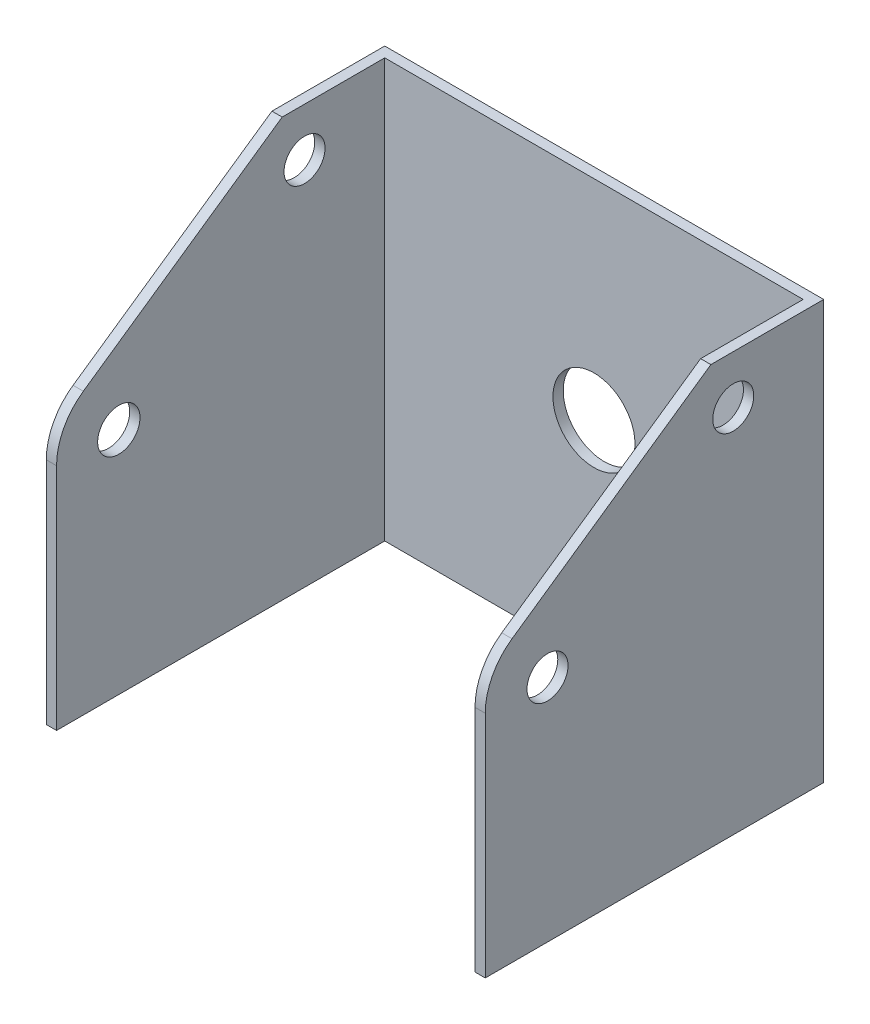
ISO-10303-21;
HEADER;
FILE_DESCRIPTION(('STEP AP214'),'2;1');
FILE_NAME('part.step','',(''),(''),'','','');
FILE_SCHEMA(('AUTOMOTIVE_DESIGN { 1 0 10303 214 1 1 1 1 }'));
ENDSEC;
DATA;
#1=APPLICATION_CONTEXT('core data for automotive mechanical design processes');
#2=APPLICATION_PROTOCOL_DEFINITION('international standard','automotive_design',2000,#1);
#3=PRODUCT_CONTEXT('',#1,'mechanical');
#4=PRODUCT('Part','Part','',(#3));
#5=PRODUCT_RELATED_PRODUCT_CATEGORY('part','',(#4));
#6=PRODUCT_DEFINITION_FORMATION('','',#4);
#7=PRODUCT_DEFINITION_CONTEXT('part definition',#1,'design');
#8=PRODUCT_DEFINITION('design','',#6,#7);
#9=PRODUCT_DEFINITION_SHAPE('','',#8);
#10=(LENGTH_UNIT() NAMED_UNIT(*) SI_UNIT(.MILLI.,.METRE.));
#11=(NAMED_UNIT(*) PLANE_ANGLE_UNIT() SI_UNIT($,.RADIAN.));
#12=(NAMED_UNIT(*) SI_UNIT($,.STERADIAN.) SOLID_ANGLE_UNIT());
#13=UNCERTAINTY_MEASURE_WITH_UNIT(LENGTH_MEASURE(1.E-05),#10,'distance_accuracy_value','');
#14=(GEOMETRIC_REPRESENTATION_CONTEXT(3) GLOBAL_UNCERTAINTY_ASSIGNED_CONTEXT((#13)) GLOBAL_UNIT_ASSIGNED_CONTEXT((#10,
#11,#12)) REPRESENTATION_CONTEXT('',''));
#15=CARTESIAN_POINT('',(0.,0.,0.));
#16=DIRECTION('',(0.,0.,1.));
#17=DIRECTION('',(1.,0.,0.));
#18=AXIS2_PLACEMENT_3D('',#15,#16,#17);
#19=CARTESIAN_POINT('',(0.,0.,5.));
#20=DIRECTION('',(0.,0.,-1.));
#21=DIRECTION('',(-1.,0.,0.));
#22=AXIS2_PLACEMENT_3D('',#19,#20,#21);
#23=PLANE('',#22);
#24=DIRECTION('',(0.,1.,0.));
#25=VECTOR('',#24,1.);
#26=CARTESIAN_POINT('',(102.,-102.,5.));
#27=LINE('',#26,#25);
#28=CARTESIAN_POINT('',(102.,-102.,5.));
#29=VERTEX_POINT('',#28);
#30=CARTESIAN_POINT('',(102.,102.,5.));
#31=VERTEX_POINT('',#30);
#32=EDGE_CURVE('E222',#29,#31,#27,.T.);
#33=ORIENTED_EDGE('',*,*,#32,.T.);
#34=DIRECTION('',(-1.,0.,0.));
#35=VECTOR('',#34,1.);
#36=CARTESIAN_POINT('',(-102.,102.,5.));
#37=LINE('',#36,#35);
#38=CARTESIAN_POINT('',(-102.,102.,5.));
#39=VERTEX_POINT('',#38);
#40=EDGE_CURVE('E225',#31,#39,#37,.T.);
#41=ORIENTED_EDGE('',*,*,#40,.T.);
#42=DIRECTION('',(0.,-1.,0.));
#43=VECTOR('',#42,1.);
#44=CARTESIAN_POINT('',(-102.,-102.,5.));
#45=LINE('',#44,#43);
#46=CARTESIAN_POINT('',(-102.,-102.,5.));
#47=VERTEX_POINT('',#46);
#48=EDGE_CURVE('E36',#39,#47,#45,.T.);
#49=ORIENTED_EDGE('',*,*,#48,.T.);
#50=DIRECTION('',(1.,0.,0.));
#51=VECTOR('',#50,1.);
#52=CARTESIAN_POINT('',(-102.,-102.,5.));
#53=LINE('',#52,#51);
#54=EDGE_CURVE('E11',#47,#29,#53,.T.);
#55=ORIENTED_EDGE('',*,*,#54,.T.);
#56=EDGE_LOOP('',(#33,#41,#49,#55));
#57=FACE_BOUND('',#56,.T.);
#58=CARTESIAN_POINT('',(0.,0.,5.));
#59=DIRECTION('',(0.,0.,1.));
#60=DIRECTION('',(1.,0.,0.));
#61=AXIS2_PLACEMENT_3D('',#58,#59,#60);
#62=CIRCLE('',#61,20.);
#63=CARTESIAN_POINT('',(20.,0.,5.));
#64=VERTEX_POINT('',#63);
#65=EDGE_CURVE('E134',#64,#64,#62,.T.);
#66=ORIENTED_EDGE('',*,*,#65,.F.);
#67=EDGE_LOOP('',(#66));
#68=FACE_BOUND('',#67,.T.);
#69=ADVANCED_FACE('F32',(#57,#68),#23,.F.);
#70=CARTESIAN_POINT('',(0.,0.,0.));
#71=DIRECTION('',(0.,0.,-1.));
#72=DIRECTION('',(-1.,0.,0.));
#73=AXIS2_PLACEMENT_3D('',#70,#71,#72);
#74=PLANE('',#73);
#75=DIRECTION('',(-1.,0.,0.));
#76=VECTOR('',#75,1.);
#77=CARTESIAN_POINT('',(-102.,102.,0.));
#78=LINE('',#77,#76);
#79=CARTESIAN_POINT('',(107.,102.,0.));
#80=VERTEX_POINT('',#79);
#81=CARTESIAN_POINT('',(-107.,102.,0.));
#82=VERTEX_POINT('',#81);
#83=EDGE_CURVE('E123',#80,#82,#78,.T.);
#84=ORIENTED_EDGE('',*,*,#83,.F.);
#85=DIRECTION('',(0.,1.,0.));
#86=VECTOR('',#85,1.);
#87=CARTESIAN_POINT('',(107.,-102.,0.));
#88=LINE('',#87,#86);
#89=CARTESIAN_POINT('',(107.,-102.,0.));
#90=VERTEX_POINT('',#89);
#91=EDGE_CURVE('E190',#90,#80,#88,.T.);
#92=ORIENTED_EDGE('',*,*,#91,.F.);
#93=DIRECTION('',(1.,0.,0.));
#94=VECTOR('',#93,1.);
#95=CARTESIAN_POINT('',(-102.,-102.,0.));
#96=LINE('',#95,#94);
#97=CARTESIAN_POINT('',(-107.,-102.,0.));
#98=VERTEX_POINT('',#97);
#99=EDGE_CURVE('E133',#98,#90,#96,.T.);
#100=ORIENTED_EDGE('',*,*,#99,.F.);
#101=DIRECTION('',(0.,-1.,0.));
#102=VECTOR('',#101,1.);
#103=CARTESIAN_POINT('',(-107.,102.,0.));
#104=LINE('',#103,#102);
#105=EDGE_CURVE('E137',#82,#98,#104,.T.);
#106=ORIENTED_EDGE('',*,*,#105,.F.);
#107=EDGE_LOOP('',(#84,#92,#100,#106));
#108=FACE_BOUND('',#107,.T.);
#109=CARTESIAN_POINT('',(0.,0.,0.));
#110=DIRECTION('',(0.,0.,1.));
#111=DIRECTION('',(1.,0.,0.));
#112=AXIS2_PLACEMENT_3D('',#109,#110,#111);
#113=CIRCLE('',#112,20.);
#114=CARTESIAN_POINT('',(20.,0.,0.));
#115=VERTEX_POINT('',#114);
#116=EDGE_CURVE('E215',#115,#115,#113,.T.);
#117=ORIENTED_EDGE('',*,*,#116,.T.);
#118=EDGE_LOOP('',(#117));
#119=FACE_BOUND('',#118,.T.);
#120=ADVANCED_FACE('F138',(#108,#119),#74,.T.);
#121=CARTESIAN_POINT('',(-102.,102.,5.));
#122=DIRECTION('',(0.,-1.,0.));
#123=DIRECTION('',(0.,0.,-1.));
#124=AXIS2_PLACEMENT_3D('',#121,#122,#123);
#125=PLANE('',#124);
#126=ORIENTED_EDGE('',*,*,#83,.T.);
#127=DIRECTION('',(0.,0.,-1.));
#128=VECTOR('',#127,1.);
#129=CARTESIAN_POINT('',(-107.,102.,0.));
#130=LINE('',#129,#128);
#131=CARTESIAN_POINT('',(-107.,102.,55.));
#132=VERTEX_POINT('',#131);
#133=EDGE_CURVE('E127',#132,#82,#130,.T.);
#134=ORIENTED_EDGE('',*,*,#133,.F.);
#135=DIRECTION('',(1.,0.,0.));
#136=VECTOR('',#135,1.);
#137=CARTESIAN_POINT('',(-107.,102.,55.));
#138=LINE('',#137,#136);
#139=CARTESIAN_POINT('',(-102.,102.,55.));
#140=VERTEX_POINT('',#139);
#141=EDGE_CURVE('E163',#132,#140,#138,.T.);
#142=ORIENTED_EDGE('',*,*,#141,.T.);
#143=DIRECTION('',(0.,0.,-1.));
#144=VECTOR('',#143,1.);
#145=CARTESIAN_POINT('',(-102.,102.,0.));
#146=LINE('',#145,#144);
#147=EDGE_CURVE('E169',#140,#39,#146,.T.);
#148=ORIENTED_EDGE('',*,*,#147,.T.);
#149=ORIENTED_EDGE('',*,*,#40,.F.);
#150=DIRECTION('',(0.,0.,1.));
#151=VECTOR('',#150,1.);
#152=CARTESIAN_POINT('',(102.,102.,0.));
#153=LINE('',#152,#151);
#154=CARTESIAN_POINT('',(102.,102.,55.));
#155=VERTEX_POINT('',#154);
#156=EDGE_CURVE('E57',#31,#155,#153,.T.);
#157=ORIENTED_EDGE('',*,*,#156,.T.);
#158=DIRECTION('',(-1.,0.,0.));
#159=VECTOR('',#158,1.);
#160=CARTESIAN_POINT('',(107.,102.,55.));
#161=LINE('',#160,#159);
#162=CARTESIAN_POINT('',(107.,102.,55.));
#163=VERTEX_POINT('',#162);
#164=EDGE_CURVE('E218',#163,#155,#161,.T.);
#165=ORIENTED_EDGE('',*,*,#164,.F.);
#166=DIRECTION('',(0.,0.,1.));
#167=VECTOR('',#166,1.);
#168=CARTESIAN_POINT('',(107.,102.,0.));
#169=LINE('',#168,#167);
#170=EDGE_CURVE('E129',#80,#163,#169,.T.);
#171=ORIENTED_EDGE('',*,*,#170,.F.);
#172=EDGE_LOOP('',(#126,#134,#142,#148,#149,#157,#165,#171));
#173=FACE_BOUND('',#172,.T.);
#174=ADVANCED_FACE('F34',(#173),#125,.F.);
#175=CARTESIAN_POINT('',(-102.,-102.,5.));
#176=DIRECTION('',(0.,1.,0.));
#177=DIRECTION('',(0.,0.,1.));
#178=AXIS2_PLACEMENT_3D('',#175,#176,#177);
#179=PLANE('',#178);
#180=ORIENTED_EDGE('',*,*,#99,.T.);
#181=DIRECTION('',(0.,0.,-1.));
#182=VECTOR('',#181,1.);
#183=CARTESIAN_POINT('',(107.,-102.,165.));
#184=LINE('',#183,#182);
#185=CARTESIAN_POINT('',(107.,-102.,165.));
#186=VERTEX_POINT('',#185);
#187=EDGE_CURVE('E200',#186,#90,#184,.T.);
#188=ORIENTED_EDGE('',*,*,#187,.F.);
#189=DIRECTION('',(-1.,0.,0.));
#190=VECTOR('',#189,1.);
#191=CARTESIAN_POINT('',(107.,-102.,165.));
#192=LINE('',#191,#190);
#193=CARTESIAN_POINT('',(102.,-102.,165.));
#194=VERTEX_POINT('',#193);
#195=EDGE_CURVE('E203',#186,#194,#192,.T.);
#196=ORIENTED_EDGE('',*,*,#195,.T.);
#197=DIRECTION('',(0.,0.,-1.));
#198=VECTOR('',#197,1.);
#199=CARTESIAN_POINT('',(102.,-102.,0.));
#200=LINE('',#199,#198);
#201=EDGE_CURVE('E192',#194,#29,#200,.T.);
#202=ORIENTED_EDGE('',*,*,#201,.T.);
#203=ORIENTED_EDGE('',*,*,#54,.F.);
#204=DIRECTION('',(0.,0.,1.));
#205=VECTOR('',#204,1.);
#206=CARTESIAN_POINT('',(-102.,-102.,0.));
#207=LINE('',#206,#205);
#208=CARTESIAN_POINT('',(-102.,-102.,165.));
#209=VERTEX_POINT('',#208);
#210=EDGE_CURVE('E49',#47,#209,#207,.T.);
#211=ORIENTED_EDGE('',*,*,#210,.T.);
#212=DIRECTION('',(1.,0.,0.));
#213=VECTOR('',#212,1.);
#214=CARTESIAN_POINT('',(-107.,-102.,165.));
#215=LINE('',#214,#213);
#216=CARTESIAN_POINT('',(-107.,-102.,165.));
#217=VERTEX_POINT('',#216);
#218=EDGE_CURVE('E174',#217,#209,#215,.T.);
#219=ORIENTED_EDGE('',*,*,#218,.F.);
#220=DIRECTION('',(0.,0.,1.));
#221=VECTOR('',#220,1.);
#222=CARTESIAN_POINT('',(-107.,-102.,0.));
#223=LINE('',#222,#221);
#224=EDGE_CURVE('E142',#98,#217,#223,.T.);
#225=ORIENTED_EDGE('',*,*,#224,.F.);
#226=EDGE_LOOP('',(#180,#188,#196,#202,#203,#211,#219,#225));
#227=FACE_BOUND('',#226,.T.);
#228=ADVANCED_FACE('F233',(#227),#179,.F.);
#229=CARTESIAN_POINT('',(0.,0.,5.));
#230=DIRECTION('',(0.,0.,-1.));
#231=DIRECTION('',(-1.,0.,0.));
#232=AXIS2_PLACEMENT_3D('',#229,#230,#231);
#233=CYLINDRICAL_SURFACE('',#232,20.);
#234=ORIENTED_EDGE('',*,*,#65,.T.);
#235=EDGE_LOOP('',(#234));
#236=FACE_BOUND('',#235,.T.);
#237=ORIENTED_EDGE('',*,*,#116,.F.);
#238=EDGE_LOOP('',(#237));
#239=FACE_BOUND('',#238,.T.);
#240=ADVANCED_FACE('F313',(#236,#239),#233,.F.);
#241=CARTESIAN_POINT('',(107.,9.78431372549014,134.644967246909));
#242=DIRECTION('',(1.,0.,0.));
#243=DIRECTION('',(0.,0.,-1.));
#244=AXIS2_PLACEMENT_3D('',#241,#242,#243);
#245=PLANE('',#244);
#246=CARTESIAN_POINT('',(107.,78.4509803921569,44.1071839444485));
#247=DIRECTION('',(1.,0.,0.));
#248=DIRECTION('',(0.,0.,-1.));
#249=AXIS2_PLACEMENT_3D('',#246,#247,#248);
#250=CIRCLE('',#249,10.);
#251=CARTESIAN_POINT('',(107.,78.4509803921569,34.1071839444485));
#252=VERTEX_POINT('',#251);
#253=EDGE_CURVE('E185',#252,#252,#250,.T.);
#254=ORIENTED_EDGE('',*,*,#253,.F.);
#255=EDGE_LOOP('',(#254));
#256=FACE_BOUND('',#255,.T.);
#257=ORIENTED_EDGE('',*,*,#91,.T.);
#258=ORIENTED_EDGE('',*,*,#170,.T.);
#259=DIRECTION('',(0.,-0.570110460222537,0.82156805143874));
#260=VECTOR('',#259,1.);
#261=CARTESIAN_POINT('',(107.,102.,55.));
#262=LINE('',#261,#260);
#263=CARTESIAN_POINT('',(107.,34.7230388358063,151.950688939844));
#264=VERTEX_POINT('',#263);
#265=EDGE_CURVE('E194',#163,#264,#262,.T.);
#266=ORIENTED_EDGE('',*,*,#265,.T.);
#267=CARTESIAN_POINT('',(107.,9.78431372549014,134.644967246909));
#268=DIRECTION('',(1.,0.,0.));
#269=DIRECTION('',(0.,0.,-1.));
#270=AXIS2_PLACEMENT_3D('',#267,#268,#269);
#271=CIRCLE('',#270,30.355032753091);
#272=CARTESIAN_POINT('',(107.,9.78431372549015,165.));
#273=VERTEX_POINT('',#272);
#274=EDGE_CURVE('E196',#264,#273,#271,.T.);
#275=ORIENTED_EDGE('',*,*,#274,.T.);
#276=DIRECTION('',(0.,-1.,0.));
#277=VECTOR('',#276,1.);
#278=CARTESIAN_POINT('',(107.,-102.,165.));
#279=LINE('',#278,#277);
#280=EDGE_CURVE('E198',#273,#186,#279,.T.);
#281=ORIENTED_EDGE('',*,*,#280,.T.);
#282=ORIENTED_EDGE('',*,*,#187,.T.);
#283=EDGE_LOOP('',(#257,#258,#266,#275,#281,#282));
#284=FACE_BOUND('',#283,.T.);
#285=CARTESIAN_POINT('',(107.,9.78431372549014,134.644967246909));
#286=DIRECTION('',(1.,0.,0.));
#287=DIRECTION('',(0.,0.,-1.));
#288=AXIS2_PLACEMENT_3D('',#285,#286,#287);
#289=CIRCLE('',#288,10.);
#290=CARTESIAN_POINT('',(107.,9.78431372549014,124.644967246909));
#291=VERTEX_POINT('',#290);
#292=EDGE_CURVE('E178',#291,#291,#289,.T.);
#293=ORIENTED_EDGE('',*,*,#292,.F.);
#294=EDGE_LOOP('',(#293));
#295=FACE_BOUND('',#294,.T.);
#296=ADVANCED_FACE('F237',(#256,#284,#295),#245,.T.);
#297=CARTESIAN_POINT('',(102.,9.78431372549014,134.644967246909));
#298=DIRECTION('',(1.,0.,0.));
#299=DIRECTION('',(0.,0.,-1.));
#300=AXIS2_PLACEMENT_3D('',#297,#298,#299);
#301=PLANE('',#300);
#302=ORIENTED_EDGE('',*,*,#32,.F.);
#303=ORIENTED_EDGE('',*,*,#201,.F.);
#304=DIRECTION('',(0.,-1.,0.));
#305=VECTOR('',#304,1.);
#306=CARTESIAN_POINT('',(102.,-102.,165.));
#307=LINE('',#306,#305);
#308=CARTESIAN_POINT('',(102.,9.78431372549015,165.));
#309=VERTEX_POINT('',#308);
#310=EDGE_CURVE('E248',#309,#194,#307,.T.);
#311=ORIENTED_EDGE('',*,*,#310,.F.);
#312=CARTESIAN_POINT('',(102.,9.78431372549014,134.644967246909));
#313=DIRECTION('',(1.,0.,0.));
#314=DIRECTION('',(0.,0.,-1.));
#315=AXIS2_PLACEMENT_3D('',#312,#313,#314);
#316=CIRCLE('',#315,30.355032753091);
#317=CARTESIAN_POINT('',(102.,34.7230388358063,151.950688939844));
#318=VERTEX_POINT('',#317);
#319=EDGE_CURVE('E266',#318,#309,#316,.T.);
#320=ORIENTED_EDGE('',*,*,#319,.F.);
#321=DIRECTION('',(0.,-0.570110460222537,0.82156805143874));
#322=VECTOR('',#321,1.);
#323=CARTESIAN_POINT('',(102.,102.,55.));
#324=LINE('',#323,#322);
#325=EDGE_CURVE('E206',#155,#318,#324,.T.);
#326=ORIENTED_EDGE('',*,*,#325,.F.);
#327=ORIENTED_EDGE('',*,*,#156,.F.);
#328=EDGE_LOOP('',(#302,#303,#311,#320,#326,#327));
#329=FACE_BOUND('',#328,.T.);
#330=CARTESIAN_POINT('',(102.,78.4509803921569,44.1071839444485));
#331=DIRECTION('',(1.,0.,0.));
#332=DIRECTION('',(0.,0.,-1.));
#333=AXIS2_PLACEMENT_3D('',#330,#331,#332);
#334=CIRCLE('',#333,10.);
#335=CARTESIAN_POINT('',(102.,78.4509803921569,34.1071839444485));
#336=VERTEX_POINT('',#335);
#337=EDGE_CURVE('E181',#336,#336,#334,.T.);
#338=ORIENTED_EDGE('',*,*,#337,.T.);
#339=EDGE_LOOP('',(#338));
#340=FACE_BOUND('',#339,.T.);
#341=CARTESIAN_POINT('',(102.,9.78431372549014,134.644967246909));
#342=DIRECTION('',(1.,0.,0.));
#343=DIRECTION('',(0.,0.,-1.));
#344=AXIS2_PLACEMENT_3D('',#341,#342,#343);
#345=CIRCLE('',#344,10.);
#346=CARTESIAN_POINT('',(102.,9.78431372549014,124.644967246909));
#347=VERTEX_POINT('',#346);
#348=EDGE_CURVE('E182',#347,#347,#345,.T.);
#349=ORIENTED_EDGE('',*,*,#348,.T.);
#350=EDGE_LOOP('',(#349));
#351=FACE_BOUND('',#350,.T.);
#352=ADVANCED_FACE('F264',(#329,#340,#351),#301,.F.);
#353=CARTESIAN_POINT('',(107.,102.,55.));
#354=DIRECTION('',(0.,-0.82156805143874,-0.570110460222537));
#355=DIRECTION('',(0.,0.570110460222537,-0.82156805143874));
#356=AXIS2_PLACEMENT_3D('',#353,#354,#355);
#357=PLANE('',#356);
#358=ORIENTED_EDGE('',*,*,#325,.T.);
#359=DIRECTION('',(-1.,0.,0.));
#360=VECTOR('',#359,1.);
#361=CARTESIAN_POINT('',(107.,34.7230388358063,151.950688939844));
#362=LINE('',#361,#360);
#363=EDGE_CURVE('E252',#264,#318,#362,.T.);
#364=ORIENTED_EDGE('',*,*,#363,.F.);
#365=ORIENTED_EDGE('',*,*,#265,.F.);
#366=ORIENTED_EDGE('',*,*,#164,.T.);
#367=EDGE_LOOP('',(#358,#364,#365,#366));
#368=FACE_BOUND('',#367,.T.);
#369=ADVANCED_FACE('F261',(#368),#357,.F.);
#370=CARTESIAN_POINT('',(107.,9.78431372549014,134.644967246909));
#371=DIRECTION('',(-1.,0.,0.));
#372=DIRECTION('',(0.,0.,1.));
#373=AXIS2_PLACEMENT_3D('',#370,#371,#372);
#374=CYLINDRICAL_SURFACE('',#373,30.355032753091);
#375=ORIENTED_EDGE('',*,*,#319,.T.);
#376=DIRECTION('',(-1.,0.,0.));
#377=VECTOR('',#376,1.);
#378=CARTESIAN_POINT('',(107.,9.78431372549015,165.));
#379=LINE('',#378,#377);
#380=EDGE_CURVE('E250',#273,#309,#379,.T.);
#381=ORIENTED_EDGE('',*,*,#380,.F.);
#382=ORIENTED_EDGE('',*,*,#274,.F.);
#383=ORIENTED_EDGE('',*,*,#363,.T.);
#384=EDGE_LOOP('',(#375,#381,#382,#383));
#385=FACE_BOUND('',#384,.T.);
#386=ADVANCED_FACE('F363',(#385),#374,.T.);
#387=CARTESIAN_POINT('',(107.,-102.,165.));
#388=DIRECTION('',(0.,0.,-1.));
#389=DIRECTION('',(-1.,0.,0.));
#390=AXIS2_PLACEMENT_3D('',#387,#388,#389);
#391=PLANE('',#390);
#392=ORIENTED_EDGE('',*,*,#310,.T.);
#393=ORIENTED_EDGE('',*,*,#195,.F.);
#394=ORIENTED_EDGE('',*,*,#280,.F.);
#395=ORIENTED_EDGE('',*,*,#380,.T.);
#396=EDGE_LOOP('',(#392,#393,#394,#395));
#397=FACE_BOUND('',#396,.T.);
#398=ADVANCED_FACE('F246',(#397),#391,.F.);
#399=CARTESIAN_POINT('',(107.,78.4509803921569,44.1071839444485));
#400=DIRECTION('',(-1.,0.,0.));
#401=DIRECTION('',(0.,0.,1.));
#402=AXIS2_PLACEMENT_3D('',#399,#400,#401);
#403=CYLINDRICAL_SURFACE('',#402,10.);
#404=ORIENTED_EDGE('',*,*,#253,.T.);
#405=EDGE_LOOP('',(#404));
#406=FACE_BOUND('',#405,.T.);
#407=ORIENTED_EDGE('',*,*,#337,.F.);
#408=EDGE_LOOP('',(#407));
#409=FACE_BOUND('',#408,.T.);
#410=ADVANCED_FACE('F343',(#406,#409),#403,.F.);
#411=CARTESIAN_POINT('',(107.,9.78431372549014,134.644967246909));
#412=DIRECTION('',(-1.,0.,0.));
#413=DIRECTION('',(0.,0.,1.));
#414=AXIS2_PLACEMENT_3D('',#411,#412,#413);
#415=CYLINDRICAL_SURFACE('',#414,10.);
#416=ORIENTED_EDGE('',*,*,#292,.T.);
#417=EDGE_LOOP('',(#416));
#418=FACE_BOUND('',#417,.T.);
#419=ORIENTED_EDGE('',*,*,#348,.F.);
#420=EDGE_LOOP('',(#419));
#421=FACE_BOUND('',#420,.T.);
#422=ADVANCED_FACE('F339',(#418,#421),#415,.F.);
#423=CARTESIAN_POINT('',(-107.,9.78431372549014,134.644967246909));
#424=DIRECTION('',(-1.,0.,0.));
#425=DIRECTION('',(0.,0.,1.));
#426=AXIS2_PLACEMENT_3D('',#423,#424,#425);
#427=PLANE('',#426);
#428=CARTESIAN_POINT('',(-107.,78.4509803921569,44.1071839444485));
#429=DIRECTION('',(-1.,0.,0.));
#430=DIRECTION('',(0.,0.,1.));
#431=AXIS2_PLACEMENT_3D('',#428,#429,#430);
#432=CIRCLE('',#431,10.);
#433=CARTESIAN_POINT('',(-107.,78.4509803921569,54.1071839444485));
#434=VERTEX_POINT('',#433);
#435=EDGE_CURVE('E173',#434,#434,#432,.T.);
#436=ORIENTED_EDGE('',*,*,#435,.F.);
#437=EDGE_LOOP('',(#436));
#438=FACE_BOUND('',#437,.T.);
#439=ORIENTED_EDGE('',*,*,#133,.T.);
#440=ORIENTED_EDGE('',*,*,#105,.T.);
#441=ORIENTED_EDGE('',*,*,#224,.T.);
#442=DIRECTION('',(0.,1.,0.));
#443=VECTOR('',#442,1.);
#444=CARTESIAN_POINT('',(-107.,9.78431372549015,165.));
#445=LINE('',#444,#443);
#446=CARTESIAN_POINT('',(-107.,9.78431372549015,165.));
#447=VERTEX_POINT('',#446);
#448=EDGE_CURVE('E158',#217,#447,#445,.T.);
#449=ORIENTED_EDGE('',*,*,#448,.T.);
#450=CARTESIAN_POINT('',(-107.,9.78431372549014,134.644967246909));
#451=DIRECTION('',(-1.,0.,0.));
#452=DIRECTION('',(0.,0.,1.));
#453=AXIS2_PLACEMENT_3D('',#450,#451,#452);
#454=CIRCLE('',#453,30.355032753091);
#455=CARTESIAN_POINT('',(-107.,34.7230388358063,151.950688939844));
#456=VERTEX_POINT('',#455);
#457=EDGE_CURVE('E160',#447,#456,#454,.T.);
#458=ORIENTED_EDGE('',*,*,#457,.T.);
#459=DIRECTION('',(0.,0.570110460222537,-0.82156805143874));
#460=VECTOR('',#459,1.);
#461=CARTESIAN_POINT('',(-107.,102.,55.));
#462=LINE('',#461,#460);
#463=EDGE_CURVE('E147',#456,#132,#462,.T.);
#464=ORIENTED_EDGE('',*,*,#463,.T.);
#465=EDGE_LOOP('',(#439,#440,#441,#449,#458,#464));
#466=FACE_BOUND('',#465,.T.);
#467=CARTESIAN_POINT('',(-107.,9.78431372549014,134.644967246909));
#468=DIRECTION('',(-1.,0.,0.));
#469=DIRECTION('',(0.,0.,1.));
#470=AXIS2_PLACEMENT_3D('',#467,#468,#469);
#471=CIRCLE('',#470,10.3256888686789);
#472=CARTESIAN_POINT('',(-107.,9.78431372549014,144.970656115588));
#473=VERTEX_POINT('',#472);
#474=EDGE_CURVE('E477',#473,#473,#471,.T.);
#475=ORIENTED_EDGE('',*,*,#474,.F.);
#476=EDGE_LOOP('',(#475));
#477=FACE_BOUND('',#476,.T.);
#478=ADVANCED_FACE('F144',(#438,#466,#477),#427,.T.);
#479=CARTESIAN_POINT('',(-102.,9.78431372549014,134.644967246909));
#480=DIRECTION('',(-1.,0.,0.));
#481=DIRECTION('',(0.,0.,1.));
#482=AXIS2_PLACEMENT_3D('',#479,#480,#481);
#483=PLANE('',#482);
#484=ORIENTED_EDGE('',*,*,#48,.F.);
#485=ORIENTED_EDGE('',*,*,#147,.F.);
#486=DIRECTION('',(0.,0.570110460222537,-0.82156805143874));
#487=VECTOR('',#486,1.);
#488=CARTESIAN_POINT('',(-102.,102.,55.));
#489=LINE('',#488,#487);
#490=CARTESIAN_POINT('',(-102.,34.7230388358063,151.950688939844));
#491=VERTEX_POINT('',#490);
#492=EDGE_CURVE('E149',#491,#140,#489,.T.);
#493=ORIENTED_EDGE('',*,*,#492,.F.);
#494=CARTESIAN_POINT('',(-102.,9.78431372549014,134.644967246909));
#495=DIRECTION('',(-1.,0.,0.));
#496=DIRECTION('',(0.,0.,1.));
#497=AXIS2_PLACEMENT_3D('',#494,#495,#496);
#498=CIRCLE('',#497,30.355032753091);
#499=CARTESIAN_POINT('',(-102.,9.78431372549015,165.));
#500=VERTEX_POINT('',#499);
#501=EDGE_CURVE('E151',#500,#491,#498,.T.);
#502=ORIENTED_EDGE('',*,*,#501,.F.);
#503=DIRECTION('',(0.,1.,0.));
#504=VECTOR('',#503,1.);
#505=CARTESIAN_POINT('',(-102.,9.78431372549015,165.));
#506=LINE('',#505,#504);
#507=EDGE_CURVE('E177',#209,#500,#506,.T.);
#508=ORIENTED_EDGE('',*,*,#507,.F.);
#509=ORIENTED_EDGE('',*,*,#210,.F.);
#510=EDGE_LOOP('',(#484,#485,#493,#502,#508,#509));
#511=FACE_BOUND('',#510,.T.);
#512=CARTESIAN_POINT('',(-102.,78.4509803921569,44.1071839444485));
#513=DIRECTION('',(-1.,0.,0.));
#514=DIRECTION('',(0.,0.,1.));
#515=AXIS2_PLACEMENT_3D('',#512,#513,#514);
#516=CIRCLE('',#515,10.);
#517=CARTESIAN_POINT('',(-102.,78.4509803921569,54.1071839444485));
#518=VERTEX_POINT('',#517);
#519=EDGE_CURVE('E154',#518,#518,#516,.T.);
#520=ORIENTED_EDGE('',*,*,#519,.T.);
#521=EDGE_LOOP('',(#520));
#522=FACE_BOUND('',#521,.T.);
#523=CARTESIAN_POINT('',(-102.,9.78431372549014,134.644967246909));
#524=DIRECTION('',(-1.,0.,0.));
#525=DIRECTION('',(0.,0.,1.));
#526=AXIS2_PLACEMENT_3D('',#523,#524,#525);
#527=CIRCLE('',#526,10.3256888686789);
#528=CARTESIAN_POINT('',(-102.,9.78431372549014,144.970656115588));
#529=VERTEX_POINT('',#528);
#530=EDGE_CURVE('E480',#529,#529,#527,.T.);
#531=ORIENTED_EDGE('',*,*,#530,.T.);
#532=EDGE_LOOP('',(#531));
#533=FACE_BOUND('',#532,.T.);
#534=ADVANCED_FACE('F272',(#511,#522,#533),#483,.F.);
#535=CARTESIAN_POINT('',(-107.,9.78431372549015,165.));
#536=DIRECTION('',(0.,0.,-1.));
#537=DIRECTION('',(-1.,0.,0.));
#538=AXIS2_PLACEMENT_3D('',#535,#536,#537);
#539=PLANE('',#538);
#540=ORIENTED_EDGE('',*,*,#507,.T.);
#541=DIRECTION('',(1.,0.,0.));
#542=VECTOR('',#541,1.);
#543=CARTESIAN_POINT('',(-107.,9.78431372549015,165.));
#544=LINE('',#543,#542);
#545=EDGE_CURVE('E279',#447,#500,#544,.T.);
#546=ORIENTED_EDGE('',*,*,#545,.F.);
#547=ORIENTED_EDGE('',*,*,#448,.F.);
#548=ORIENTED_EDGE('',*,*,#218,.T.);
#549=EDGE_LOOP('',(#540,#546,#547,#548));
#550=FACE_BOUND('',#549,.T.);
#551=ADVANCED_FACE('F290',(#550),#539,.F.);
#552=CARTESIAN_POINT('',(-107.,9.78431372549014,134.644967246909));
#553=DIRECTION('',(1.,0.,0.));
#554=DIRECTION('',(0.,0.,-1.));
#555=AXIS2_PLACEMENT_3D('',#552,#553,#554);
#556=CYLINDRICAL_SURFACE('',#555,30.355032753091);
#557=ORIENTED_EDGE('',*,*,#501,.T.);
#558=DIRECTION('',(1.,0.,0.));
#559=VECTOR('',#558,1.);
#560=CARTESIAN_POINT('',(-107.,34.7230388358063,151.950688939844));
#561=LINE('',#560,#559);
#562=EDGE_CURVE('E276',#456,#491,#561,.T.);
#563=ORIENTED_EDGE('',*,*,#562,.F.);
#564=ORIENTED_EDGE('',*,*,#457,.F.);
#565=ORIENTED_EDGE('',*,*,#545,.T.);
#566=EDGE_LOOP('',(#557,#563,#564,#565));
#567=FACE_BOUND('',#566,.T.);
#568=ADVANCED_FACE('F292',(#567),#556,.T.);
#569=CARTESIAN_POINT('',(-107.,102.,55.));
#570=DIRECTION('',(0.,-0.82156805143874,-0.570110460222537));
#571=DIRECTION('',(0.,0.570110460222537,-0.82156805143874));
#572=AXIS2_PLACEMENT_3D('',#569,#570,#571);
#573=PLANE('',#572);
#574=ORIENTED_EDGE('',*,*,#492,.T.);
#575=ORIENTED_EDGE('',*,*,#141,.F.);
#576=ORIENTED_EDGE('',*,*,#463,.F.);
#577=ORIENTED_EDGE('',*,*,#562,.T.);
#578=EDGE_LOOP('',(#574,#575,#576,#577));
#579=FACE_BOUND('',#578,.T.);
#580=ADVANCED_FACE('F293',(#579),#573,.F.);
#581=CARTESIAN_POINT('',(-107.,78.4509803921569,44.1071839444485));
#582=DIRECTION('',(1.,0.,0.));
#583=DIRECTION('',(0.,0.,-1.));
#584=AXIS2_PLACEMENT_3D('',#581,#582,#583);
#585=CYLINDRICAL_SURFACE('',#584,10.);
#586=ORIENTED_EDGE('',*,*,#435,.T.);
#587=EDGE_LOOP('',(#586));
#588=FACE_BOUND('',#587,.T.);
#589=ORIENTED_EDGE('',*,*,#519,.F.);
#590=EDGE_LOOP('',(#589));
#591=FACE_BOUND('',#590,.T.);
#592=ADVANCED_FACE('F295',(#588,#591),#585,.F.);
#593=CARTESIAN_POINT('',(-107.,9.78431372549014,134.644967246909));
#594=DIRECTION('',(1.,0.,0.));
#595=DIRECTION('',(0.,0.,-1.));
#596=AXIS2_PLACEMENT_3D('',#593,#594,#595);
#597=CYLINDRICAL_SURFACE('',#596,10.3256888686789);
#598=ORIENTED_EDGE('',*,*,#474,.T.);
#599=EDGE_LOOP('',(#598));
#600=FACE_BOUND('',#599,.T.);
#601=ORIENTED_EDGE('',*,*,#530,.F.);
#602=EDGE_LOOP('',(#601));
#603=FACE_BOUND('',#602,.T.);
#604=ADVANCED_FACE('F301',(#600,#603),#597,.F.);
#605=CLOSED_SHELL('',(#69,#120,#174,#228,#240,#296,#352,#369,#386,#398,#410,#422,#478,#534,#551,
#568,#580,#592,#604));
#606=MANIFOLD_SOLID_BREP('B2',#605);
#607=ADVANCED_BREP_SHAPE_REPRESENTATION('',(#18,#606),#14);
#608=SHAPE_DEFINITION_REPRESENTATION(#9,#607);
ENDSEC;
END-ISO-10303-21;
